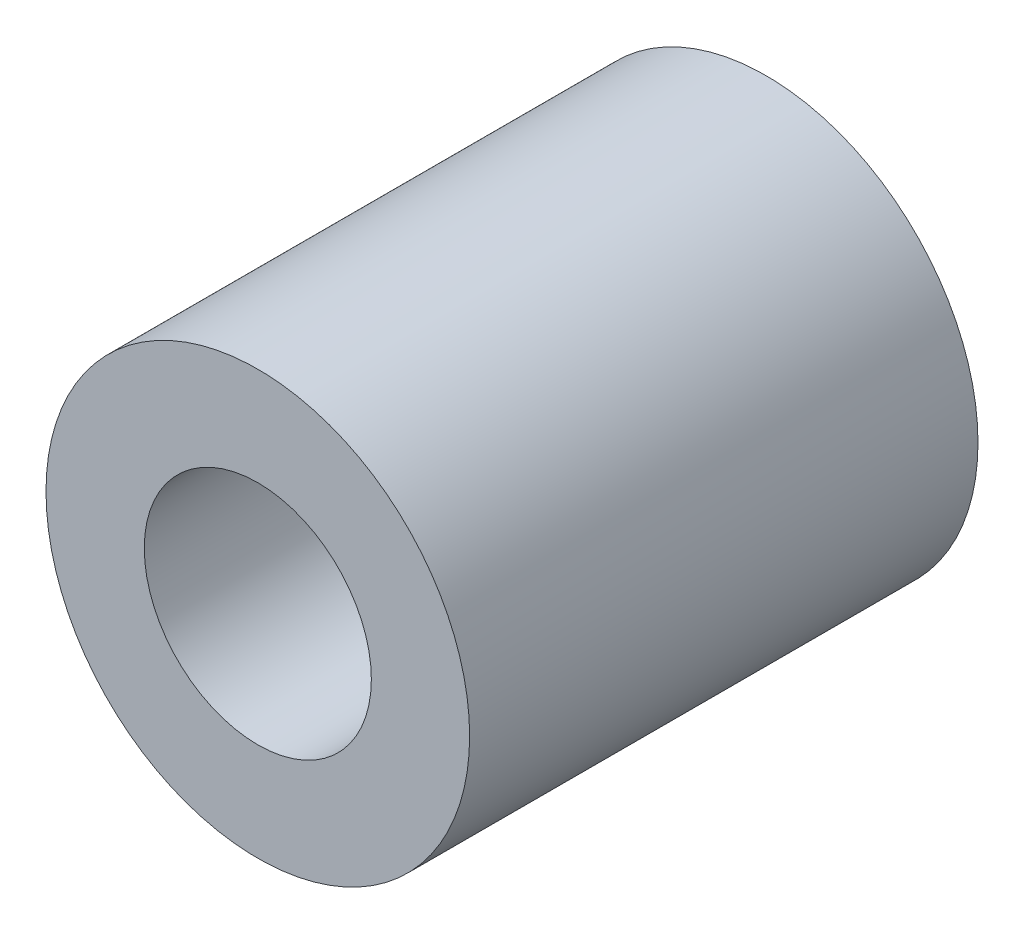
ISO-10303-21;
HEADER;
FILE_DESCRIPTION(('STEP AP214'),'2;1');
FILE_NAME('part.step','',(''),(''),'','','');
FILE_SCHEMA(('AUTOMOTIVE_DESIGN { 1 0 10303 214 1 1 1 1 }'));
ENDSEC;
DATA;
#1=APPLICATION_CONTEXT('core data for automotive mechanical design processes');
#2=APPLICATION_PROTOCOL_DEFINITION('international standard','automotive_design',2000,#1);
#3=PRODUCT_CONTEXT('',#1,'mechanical');
#4=PRODUCT('Part','Part','',(#3));
#5=PRODUCT_RELATED_PRODUCT_CATEGORY('part','',(#4));
#6=PRODUCT_DEFINITION_FORMATION('','',#4);
#7=PRODUCT_DEFINITION_CONTEXT('part definition',#1,'design');
#8=PRODUCT_DEFINITION('design','',#6,#7);
#9=PRODUCT_DEFINITION_SHAPE('','',#8);
#10=(LENGTH_UNIT() NAMED_UNIT(*) SI_UNIT(.MILLI.,.METRE.));
#11=(NAMED_UNIT(*) PLANE_ANGLE_UNIT() SI_UNIT($,.RADIAN.));
#12=(NAMED_UNIT(*) SI_UNIT($,.STERADIAN.) SOLID_ANGLE_UNIT());
#13=UNCERTAINTY_MEASURE_WITH_UNIT(LENGTH_MEASURE(1.E-05),#10,'distance_accuracy_value','');
#14=(GEOMETRIC_REPRESENTATION_CONTEXT(3) GLOBAL_UNCERTAINTY_ASSIGNED_CONTEXT((#13)) GLOBAL_UNIT_ASSIGNED_CONTEXT((#10,
#11,#12)) REPRESENTATION_CONTEXT('',''));
#15=CARTESIAN_POINT('',(0.,0.,0.));
#16=DIRECTION('',(0.,0.,1.));
#17=DIRECTION('',(1.,0.,0.));
#18=AXIS2_PLACEMENT_3D('',#15,#16,#17);
#19=CARTESIAN_POINT('',(0.,0.,11.43));
#20=DIRECTION('',(0.,0.,1.));
#21=DIRECTION('',(1.,0.,0.));
#22=AXIS2_PLACEMENT_3D('',#19,#20,#21);
#23=PLANE('',#22);
#24=CARTESIAN_POINT('',(0.,0.,11.43));
#25=DIRECTION('',(0.,0.,1.));
#26=DIRECTION('',(1.,0.,0.));
#27=AXIS2_PLACEMENT_3D('',#24,#25,#26);
#28=CIRCLE('',#27,4.7625);
#29=CARTESIAN_POINT('',(4.7625,0.,11.43));
#30=VERTEX_POINT('',#29);
#31=EDGE_CURVE('E10',#30,#30,#28,.T.);
#32=ORIENTED_EDGE('',*,*,#31,.T.);
#33=EDGE_LOOP('',(#32));
#34=FACE_BOUND('',#33,.T.);
#35=CARTESIAN_POINT('',(0.,0.,11.43));
#36=DIRECTION('',(0.,0.,1.));
#37=DIRECTION('',(1.,0.,0.));
#38=AXIS2_PLACEMENT_3D('',#35,#36,#37);
#39=CIRCLE('',#38,2.5527);
#40=CARTESIAN_POINT('',(2.5527,0.,11.43));
#41=VERTEX_POINT('',#40);
#42=EDGE_CURVE('E45',#41,#41,#39,.T.);
#43=ORIENTED_EDGE('',*,*,#42,.F.);
#44=EDGE_LOOP('',(#43));
#45=FACE_BOUND('',#44,.T.);
#46=ADVANCED_FACE('F34',(#34,#45),#23,.T.);
#47=CARTESIAN_POINT('',(0.,0.,0.));
#48=DIRECTION('',(0.,0.,1.));
#49=DIRECTION('',(1.,0.,0.));
#50=AXIS2_PLACEMENT_3D('',#47,#48,#49);
#51=PLANE('',#50);
#52=CARTESIAN_POINT('',(0.,0.,0.));
#53=DIRECTION('',(0.,0.,1.));
#54=DIRECTION('',(1.,0.,0.));
#55=AXIS2_PLACEMENT_3D('',#52,#53,#54);
#56=CIRCLE('',#55,4.7625);
#57=CARTESIAN_POINT('',(4.7625,0.,0.));
#58=VERTEX_POINT('',#57);
#59=EDGE_CURVE('E38',#58,#58,#56,.T.);
#60=ORIENTED_EDGE('',*,*,#59,.F.);
#61=EDGE_LOOP('',(#60));
#62=FACE_BOUND('',#61,.T.);
#63=CARTESIAN_POINT('',(0.,0.,0.));
#64=DIRECTION('',(0.,0.,1.));
#65=DIRECTION('',(1.,0.,0.));
#66=AXIS2_PLACEMENT_3D('',#63,#64,#65);
#67=CIRCLE('',#66,2.5527);
#68=CARTESIAN_POINT('',(2.5527,0.,0.));
#69=VERTEX_POINT('',#68);
#70=EDGE_CURVE('E47',#69,#69,#67,.T.);
#71=ORIENTED_EDGE('',*,*,#70,.T.);
#72=EDGE_LOOP('',(#71));
#73=FACE_BOUND('',#72,.T.);
#74=ADVANCED_FACE('F57',(#62,#73),#51,.F.);
#75=CARTESIAN_POINT('',(0.,0.,11.43));
#76=DIRECTION('',(0.,0.,-1.));
#77=DIRECTION('',(-1.,0.,0.));
#78=AXIS2_PLACEMENT_3D('',#75,#76,#77);
#79=CYLINDRICAL_SURFACE('',#78,4.7625);
#80=ORIENTED_EDGE('',*,*,#31,.F.);
#81=EDGE_LOOP('',(#80));
#82=FACE_BOUND('',#81,.T.);
#83=ORIENTED_EDGE('',*,*,#59,.T.);
#84=EDGE_LOOP('',(#83));
#85=FACE_BOUND('',#84,.T.);
#86=ADVANCED_FACE('F36',(#82,#85),#79,.T.);
#87=CARTESIAN_POINT('',(0.,0.,11.43));
#88=DIRECTION('',(0.,0.,-1.));
#89=DIRECTION('',(-1.,0.,0.));
#90=AXIS2_PLACEMENT_3D('',#87,#88,#89);
#91=CYLINDRICAL_SURFACE('',#90,2.5527);
#92=ORIENTED_EDGE('',*,*,#42,.T.);
#93=EDGE_LOOP('',(#92));
#94=FACE_BOUND('',#93,.T.);
#95=ORIENTED_EDGE('',*,*,#70,.F.);
#96=EDGE_LOOP('',(#95));
#97=FACE_BOUND('',#96,.T.);
#98=ADVANCED_FACE('F53',(#94,#97),#91,.F.);
#99=CLOSED_SHELL('',(#46,#74,#86,#98));
#100=MANIFOLD_SOLID_BREP('B2',#99);
#101=ADVANCED_BREP_SHAPE_REPRESENTATION('',(#18,#100),#14);
#102=SHAPE_DEFINITION_REPRESENTATION(#9,#101);
ENDSEC;
END-ISO-10303-21;
